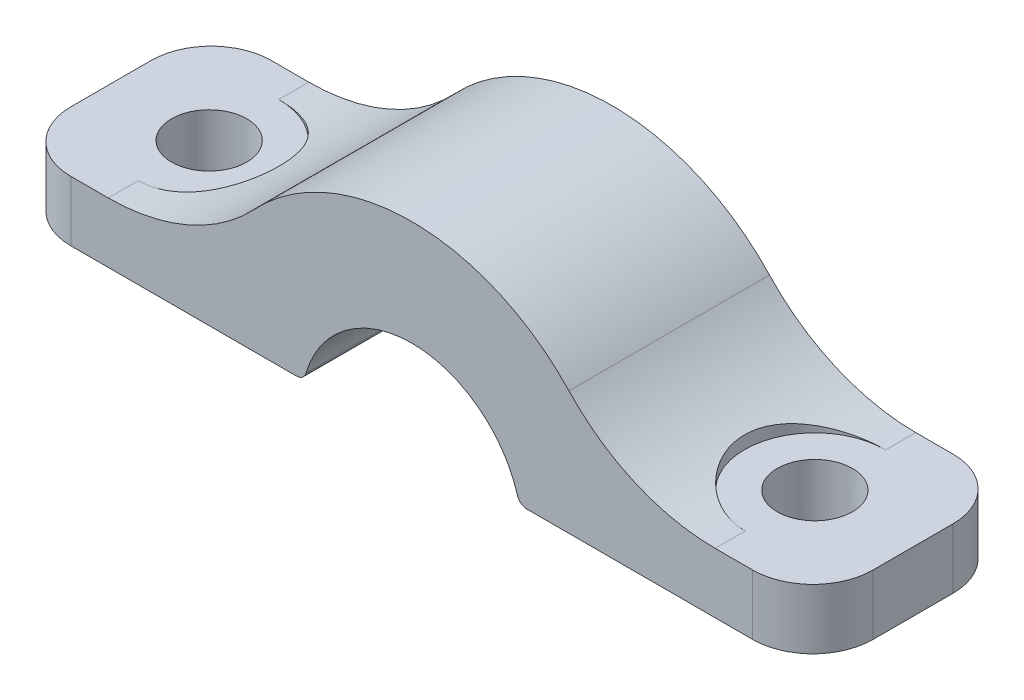
ISO-10303-21;
HEADER;
FILE_DESCRIPTION(('STEP AP214'),'2;1');
FILE_NAME('part.step','',(''),(''),'','','');
FILE_SCHEMA(('AUTOMOTIVE_DESIGN { 1 0 10303 214 1 1 1 1 }'));
ENDSEC;
DATA;
#1=APPLICATION_CONTEXT('core data for automotive mechanical design processes');
#2=APPLICATION_PROTOCOL_DEFINITION('international standard','automotive_design',2000,#1);
#3=PRODUCT_CONTEXT('',#1,'mechanical');
#4=PRODUCT('Part','Part','',(#3));
#5=PRODUCT_RELATED_PRODUCT_CATEGORY('part','',(#4));
#6=PRODUCT_DEFINITION_FORMATION('','',#4);
#7=PRODUCT_DEFINITION_CONTEXT('part definition',#1,'design');
#8=PRODUCT_DEFINITION('design','',#6,#7);
#9=PRODUCT_DEFINITION_SHAPE('','',#8);
#10=(LENGTH_UNIT() NAMED_UNIT(*) SI_UNIT(.MILLI.,.METRE.));
#11=(NAMED_UNIT(*) PLANE_ANGLE_UNIT() SI_UNIT($,.RADIAN.));
#12=(NAMED_UNIT(*) SI_UNIT($,.STERADIAN.) SOLID_ANGLE_UNIT());
#13=UNCERTAINTY_MEASURE_WITH_UNIT(LENGTH_MEASURE(1.E-05),#10,'distance_accuracy_value','');
#14=(GEOMETRIC_REPRESENTATION_CONTEXT(3) GLOBAL_UNCERTAINTY_ASSIGNED_CONTEXT((#13)) GLOBAL_UNIT_ASSIGNED_CONTEXT((#10,
#11,#12)) REPRESENTATION_CONTEXT('',''));
#15=CARTESIAN_POINT('',(0.,0.,0.));
#16=DIRECTION('',(0.,0.,1.));
#17=DIRECTION('',(1.,0.,0.));
#18=AXIS2_PLACEMENT_3D('',#15,#16,#17);
#19=CARTESIAN_POINT('',(15.1301850616574,17.,-5.));
#20=DIRECTION('',(0.,0.,1.));
#21=DIRECTION('',(1.,0.,0.));
#22=AXIS2_PLACEMENT_3D('',#19,#20,#21);
#23=CYLINDRICAL_SURFACE('',#22,10.);
#24=CARTESIAN_POINT('',(15.1301850616574,7.,-3.49986983501569));
#25=CARTESIAN_POINT('',(15.0348696329907,6.99998725890674,-3.50070439081716));
#26=CARTESIAN_POINT('',(14.9395281696116,7.00136244874504,-3.49762040862543));
#27=CARTESIAN_POINT('',(14.7495117129596,7.0067996720335,-3.48370609640878));
#28=CARTESIAN_POINT('',(14.6548365637417,7.01086105413496,-3.47287764421349));
#29=CARTESIAN_POINT('',(14.4670962984712,7.021566219,-3.44360782954279));
#30=CARTESIAN_POINT('',(14.3740273175886,7.02820249840069,-3.42518857738632));
#31=CARTESIAN_POINT('',(14.1899009938911,7.0438752521454,-3.38093142087537));
#32=CARTESIAN_POINT('',(14.0988437083568,7.05291179473893,-3.35509330556991));
#33=CARTESIAN_POINT('',(13.8297123648015,7.08328601278911,-3.26679129576509));
#34=CARTESIAN_POINT('',(13.6554232684673,7.1079037637054,-3.1934993760292));
#35=CARTESIAN_POINT('',(13.3216838443193,7.16343221324355,-3.0204334792506));
#36=CARTESIAN_POINT('',(13.1622417797051,7.1943463860301,-2.92064487291019));
#37=CARTESIAN_POINT('',(12.8566663401159,7.26057682971744,-2.69348988681878));
#38=CARTESIAN_POINT('',(12.711164571322,7.29600653740614,-2.56530570998191));
#39=CARTESIAN_POINT('',(12.4432188078221,7.36675220589586,-2.28667872214386));
#40=CARTESIAN_POINT('',(12.3207817073794,7.40206812959499,-2.13622927974848));
#41=CARTESIAN_POINT('',(12.0983841869598,7.46993276060704,-1.81117467909471));
#42=CARTESIAN_POINT('',(11.9993169679978,7.50234865970444,-1.63592785091686));
#43=CARTESIAN_POINT('',(11.8323363356384,7.55902414413907,-1.26995590106795));
#44=CARTESIAN_POINT('',(11.7644112623607,7.58328678121579,-1.07923660394833));
#45=CARTESIAN_POINT('',(11.6641433439372,7.61973743997865,-0.694905598410027));
#46=CARTESIAN_POINT('',(11.6306098500974,7.63232793600543,-0.501643954956914));
#47=CARTESIAN_POINT('',(11.5963262216062,7.64520413314645,-0.111853781625235));
#48=CARTESIAN_POINT('',(11.5955647033408,7.64549410694725,0.0846735901455507));
#49=CARTESIAN_POINT('',(11.6259908541086,7.6340599894839,0.46434110227836));
#50=CARTESIAN_POINT('',(11.6554900906093,7.62297080059553,0.647639358049137));
#51=CARTESIAN_POINT('',(11.7427538845311,7.59109763556561,1.00648124824026));
#52=CARTESIAN_POINT('',(11.800521545951,7.57031259478808,1.18202402876651));
#53=CARTESIAN_POINT('',(11.9435008725372,7.52103296048786,1.52359272322675));
#54=CARTESIAN_POINT('',(12.0291228868274,7.49242418040947,1.68942962421104));
#55=CARTESIAN_POINT('',(12.2251100149727,7.43072294324442,2.00487052914516));
#56=CARTESIAN_POINT('',(12.3354830266893,7.39762905632962,2.15446932897374));
#57=CARTESIAN_POINT('',(12.5854781988014,7.32827520332393,2.44247212910893));
#58=CARTESIAN_POINT('',(12.726442053358,7.29194364762675,2.57969452212338));
#59=CARTESIAN_POINT('',(13.0298673021754,7.22181924591325,2.82896644234392));
#60=CARTESIAN_POINT('',(13.1923341324289,7.18802704524858,2.9410095848001));
#61=CARTESIAN_POINT('',(13.4502196866979,7.14172623237282,3.08840970952813));
#62=CARTESIAN_POINT('',(13.5393176008019,7.12692353445877,3.13438150090923));
#63=CARTESIAN_POINT('',(13.7213725308676,7.09930798393055,3.21860657641995));
#64=CARTESIAN_POINT('',(13.8143279351849,7.08649431070862,3.25686304560363));
#65=CARTESIAN_POINT('',(14.0033605692721,7.06323348679693,3.32527885053502));
#66=CARTESIAN_POINT('',(14.0994349212996,7.05278422174209,3.35544542515392));
#67=CARTESIAN_POINT('',(14.2940257686933,7.03454018795168,3.40742495079426));
#68=CARTESIAN_POINT('',(14.3925412764296,7.0267443639212,3.42924122322918));
#69=CARTESIAN_POINT('',(14.5970987893935,7.01366457301147,3.46532637562945));
#70=CARTESIAN_POINT('',(14.7032436620794,7.0085544751322,3.47907834647272));
#71=CARTESIAN_POINT('',(14.9163335876992,7.00171355421096,3.49681653184522));
#72=CARTESIAN_POINT('',(15.0232776189401,6.99997897765508,3.50081359490048));
#73=CARTESIAN_POINT('',(15.1301850616574,7.,3.49986983501569));
#74=B_SPLINE_CURVE_WITH_KNOTS('',3,(#24,#25,#26,#27,#28,#29,#30,#31,#32,#33,#34,#35,#36,#37,#38,
#39,#40,#41,#42,#43,#44,#45,#46,#47,#48,#49,#50,#51,#52,#53,#54,#55,#56,#57,#58,#59,#60,#61,#62,
#63,#64,#65,#66,#67,#68,#69,#70,#71,#72,#73),.UNSPECIFIED.,.F.,.F.,(4,2,2,2,2,2,2,2,2,2,2,2,2,2,
2,2,2,2,2,2,2,2,2,2,4),(0.,0.285854114880405,0.571638941169156,0.856597157966133,
1.14156347818334,1.71072836286786,2.28020814951758,2.8689273554909,3.45782225734695,
4.06649938560818,4.67494843357368,5.26153852082778,5.84792484956934,6.40328303267487,
6.95870221026835,7.52270539683434,8.08688880941185,8.68436609721936,9.28199471794532,
9.58571174317528,9.88930312954732,10.1926219477456,10.4958199922607,10.8167769111839,
11.1373767278729),.UNSPECIFIED.);
#75=CARTESIAN_POINT('',(15.1301850616574,7.,-3.49986983501569));
#76=VERTEX_POINT('',#75);
#77=CARTESIAN_POINT('',(15.1301850616574,7.,3.49986983501569));
#78=VERTEX_POINT('',#77);
#79=EDGE_CURVE('E226',#76,#78,#74,.T.);
#80=ORIENTED_EDGE('',*,*,#79,.F.);
#81=DIRECTION('',(0.,0.,1.));
#82=VECTOR('',#81,1.);
#83=CARTESIAN_POINT('',(15.1301850616574,7.,0.));
#84=LINE('',#83,#82);
#85=CARTESIAN_POINT('',(15.1301850616574,7.,-5.));
#86=VERTEX_POINT('',#85);
#87=EDGE_CURVE('E203',#86,#76,#84,.T.);
#88=ORIENTED_EDGE('',*,*,#87,.F.);
#89=CARTESIAN_POINT('',(15.1301850616574,17.,-5.));
#90=DIRECTION('',(0.,0.,-1.));
#91=DIRECTION('',(-1.,0.,0.));
#92=AXIS2_PLACEMENT_3D('',#89,#90,#91);
#93=CIRCLE('',#92,10.);
#94=CARTESIAN_POINT('',(7.83852961025623,10.1566265060241,-5.));
#95=VERTEX_POINT('',#94);
#96=EDGE_CURVE('E210',#95,#86,#93,.F.);
#97=ORIENTED_EDGE('',*,*,#96,.F.);
#98=DIRECTION('',(0.,0.,1.));
#99=VECTOR('',#98,1.);
#100=CARTESIAN_POINT('',(7.83852961025623,10.1566265060241,-5.));
#101=LINE('',#100,#99);
#102=CARTESIAN_POINT('',(7.83852961025623,10.1566265060241,5.));
#103=VERTEX_POINT('',#102);
#104=EDGE_CURVE('E199',#103,#95,#101,.F.);
#105=ORIENTED_EDGE('',*,*,#104,.F.);
#106=CARTESIAN_POINT('',(15.1301850616574,17.,5.));
#107=DIRECTION('',(0.,0.,-1.));
#108=DIRECTION('',(-1.,0.,0.));
#109=AXIS2_PLACEMENT_3D('',#106,#107,#108);
#110=CIRCLE('',#109,10.);
#111=CARTESIAN_POINT('',(15.1301850616574,7.,5.));
#112=VERTEX_POINT('',#111);
#113=EDGE_CURVE('E212',#112,#103,#110,.T.);
#114=ORIENTED_EDGE('',*,*,#113,.F.);
#115=EDGE_CURVE('E202',#78,#112,#84,.T.);
#116=ORIENTED_EDGE('',*,*,#115,.F.);
#117=EDGE_LOOP('',(#80,#88,#97,#105,#114,#116));
#118=FACE_BOUND('',#117,.T.);
#119=ADVANCED_FACE('F35',(#118),#23,.F.);
#120=CARTESIAN_POINT('',(-15.1301850616574,17.,-5.));
#121=DIRECTION('',(0.,0.,1.));
#122=DIRECTION('',(1.,0.,0.));
#123=AXIS2_PLACEMENT_3D('',#120,#121,#122);
#124=CYLINDRICAL_SURFACE('',#123,10.);
#125=CARTESIAN_POINT('',(-15.1301850616574,7.,3.49986983501569));
#126=CARTESIAN_POINT('',(-15.0348696329907,6.99998725890674,3.50070439081716));
#127=CARTESIAN_POINT('',(-14.9395281696116,7.00136244874504,3.49762040862543));
#128=CARTESIAN_POINT('',(-14.7495117129596,7.0067996720335,3.48370609640878));
#129=CARTESIAN_POINT('',(-14.6548365637417,7.01086105413496,3.47287764421349));
#130=CARTESIAN_POINT('',(-14.4670962984712,7.021566219,3.44360782954279));
#131=CARTESIAN_POINT('',(-14.3740273175887,7.02820249840069,3.42518857738632));
#132=CARTESIAN_POINT('',(-14.1899009938911,7.0438752521454,3.38093142087537));
#133=CARTESIAN_POINT('',(-14.0988437083568,7.05291179473893,3.35509330556992));
#134=CARTESIAN_POINT('',(-13.8297123648015,7.08328601278911,3.26679129576509));
#135=CARTESIAN_POINT('',(-13.6554232684673,7.1079037637054,3.1934993760292));
#136=CARTESIAN_POINT('',(-13.3216838443193,7.16343221324355,3.0204334792506));
#137=CARTESIAN_POINT('',(-13.1622417797051,7.1943463860301,2.9206448729102));
#138=CARTESIAN_POINT('',(-12.8566663401159,7.26057682971744,2.69348988681879));
#139=CARTESIAN_POINT('',(-12.711164571322,7.29600653740614,2.56530570998191));
#140=CARTESIAN_POINT('',(-12.4432188078221,7.36675220589586,2.28667872214387));
#141=CARTESIAN_POINT('',(-12.3207817073794,7.40206812959499,2.13622927974849));
#142=CARTESIAN_POINT('',(-12.0983841869598,7.46993276060704,1.81117467909471));
#143=CARTESIAN_POINT('',(-11.9993169679978,7.50234865970444,1.63592785091686));
#144=CARTESIAN_POINT('',(-11.8323363356384,7.55902414413907,1.26995590106796));
#145=CARTESIAN_POINT('',(-11.7644112623607,7.58328678121578,1.07923660394833));
#146=CARTESIAN_POINT('',(-11.6641433439372,7.61973743997865,0.694905598410034));
#147=CARTESIAN_POINT('',(-11.6306098500974,7.63232793600543,0.501643954956922));
#148=CARTESIAN_POINT('',(-11.5963262216062,7.64520413314645,0.111853781625242));
#149=CARTESIAN_POINT('',(-11.5955647033408,7.64549410694725,-0.084673590145544));
#150=CARTESIAN_POINT('',(-11.6259908541086,7.6340599894839,-0.464341102278354));
#151=CARTESIAN_POINT('',(-11.6554900906093,7.62297080059553,-0.647639358049131));
#152=CARTESIAN_POINT('',(-11.7427538845311,7.59109763556561,-1.00648124824025));
#153=CARTESIAN_POINT('',(-11.800521545951,7.57031259478808,-1.18202402876651));
#154=CARTESIAN_POINT('',(-11.9435008725372,7.52103296048787,-1.52359272322675));
#155=CARTESIAN_POINT('',(-12.0291228868274,7.49242418040947,-1.68942962421104));
#156=CARTESIAN_POINT('',(-12.2251100149727,7.43072294324442,-2.00487052914516));
#157=CARTESIAN_POINT('',(-12.3354830266893,7.39762905632963,-2.15446932897373));
#158=CARTESIAN_POINT('',(-12.5854781988014,7.32827520332394,-2.44247212910893));
#159=CARTESIAN_POINT('',(-12.726442053358,7.29194364762676,-2.57969452212337));
#160=CARTESIAN_POINT('',(-13.0298673021754,7.22181924591325,-2.82896644234391));
#161=CARTESIAN_POINT('',(-13.1923341324289,7.18802704524858,-2.94100958480009));
#162=CARTESIAN_POINT('',(-13.4502196866979,7.14172623237282,-3.08840970952813));
#163=CARTESIAN_POINT('',(-13.5393176008019,7.12692353445877,-3.13438150090922));
#164=CARTESIAN_POINT('',(-13.7213725308676,7.09930798393055,-3.21860657641995));
#165=CARTESIAN_POINT('',(-13.8143279351849,7.08649431070862,-3.25686304560362));
#166=CARTESIAN_POINT('',(-14.0033605692721,7.06323348679693,-3.32527885053502));
#167=CARTESIAN_POINT('',(-14.0994349212996,7.0527842217421,-3.35544542515392));
#168=CARTESIAN_POINT('',(-14.2940257686933,7.03454018795168,-3.40742495079426));
#169=CARTESIAN_POINT('',(-14.3925412764295,7.0267443639212,-3.42924122322918));
#170=CARTESIAN_POINT('',(-14.5970987893935,7.01366457301147,-3.46532637562945));
#171=CARTESIAN_POINT('',(-14.7032436620794,7.0085544751322,-3.47907834647272));
#172=CARTESIAN_POINT('',(-14.9163335876992,7.00171355421096,-3.49681653184522));
#173=CARTESIAN_POINT('',(-15.0232776189401,6.99997897765508,-3.50081359490048));
#174=CARTESIAN_POINT('',(-15.1301850616574,7.,-3.49986983501569));
#175=B_SPLINE_CURVE_WITH_KNOTS('',3,(#125,#126,#127,#128,#129,#130,#131,#132,#133,#134,#135,
#136,#137,#138,#139,#140,#141,#142,#143,#144,#145,#146,#147,#148,#149,#150,#151,#152,#153,#154,
#155,#156,#157,#158,#159,#160,#161,#162,#163,#164,#165,#166,#167,#168,#169,#170,#171,#172,#173,
#174),.UNSPECIFIED.,.F.,.F.,(4,2,2,2,2,2,2,2,2,2,2,2,2,2,2,2,2,2,2,2,2,2,2,2,4),(0.,
0.285854114880405,0.571638941169158,0.856597157966135,1.14156347818334,1.71072836286786,
2.28020814951758,2.86892735549089,3.45782225734695,4.06649938560817,4.67494843357367,
5.26153852082777,5.84792484956934,6.40328303267487,6.95870221026835,7.52270539683434,
8.08688880941185,8.68436609721936,9.28199471794532,9.58571174317527,9.88930312954732,
10.1926219477456,10.4958199922607,10.8167769111839,11.1373767278729),.UNSPECIFIED.);
#176=CARTESIAN_POINT('',(-15.1301850616574,7.,3.49986983501569));
#177=VERTEX_POINT('',#176);
#178=CARTESIAN_POINT('',(-15.1301850616574,7.,-3.49986983501569));
#179=VERTEX_POINT('',#178);
#180=EDGE_CURVE('E218',#177,#179,#175,.T.);
#181=ORIENTED_EDGE('',*,*,#180,.F.);
#182=DIRECTION('',(0.,0.,-1.));
#183=VECTOR('',#182,1.);
#184=CARTESIAN_POINT('',(-15.1301850616574,7.,-5.));
#185=LINE('',#184,#183);
#186=CARTESIAN_POINT('',(-15.1301850616574,7.,5.));
#187=VERTEX_POINT('',#186);
#188=EDGE_CURVE('E207',#187,#177,#185,.T.);
#189=ORIENTED_EDGE('',*,*,#188,.F.);
#190=CARTESIAN_POINT('',(-15.1301850616574,17.,5.));
#191=DIRECTION('',(0.,0.,-1.));
#192=DIRECTION('',(-1.,0.,0.));
#193=AXIS2_PLACEMENT_3D('',#190,#191,#192);
#194=CIRCLE('',#193,10.);
#195=CARTESIAN_POINT('',(-7.83852961025623,10.1566265060241,5.));
#196=VERTEX_POINT('',#195);
#197=EDGE_CURVE('E216',#196,#187,#194,.T.);
#198=ORIENTED_EDGE('',*,*,#197,.F.);
#199=DIRECTION('',(0.,0.,1.));
#200=VECTOR('',#199,1.);
#201=CARTESIAN_POINT('',(-7.83852961025623,10.1566265060241,-5.));
#202=LINE('',#201,#200);
#203=CARTESIAN_POINT('',(-7.83852961025623,10.1566265060241,-5.));
#204=VERTEX_POINT('',#203);
#205=EDGE_CURVE('E197',#204,#196,#202,.T.);
#206=ORIENTED_EDGE('',*,*,#205,.F.);
#207=CARTESIAN_POINT('',(-15.1301850616574,17.,-5.));
#208=DIRECTION('',(0.,0.,-1.));
#209=DIRECTION('',(-1.,0.,0.));
#210=AXIS2_PLACEMENT_3D('',#207,#208,#209);
#211=CIRCLE('',#210,10.);
#212=CARTESIAN_POINT('',(-15.1301850616574,7.,-5.));
#213=VERTEX_POINT('',#212);
#214=EDGE_CURVE('E214',#213,#204,#211,.F.);
#215=ORIENTED_EDGE('',*,*,#214,.F.);
#216=EDGE_CURVE('E206',#179,#213,#185,.T.);
#217=ORIENTED_EDGE('',*,*,#216,.F.);
#218=EDGE_LOOP('',(#181,#189,#198,#206,#215,#217));
#219=FACE_BOUND('',#218,.T.);
#220=ADVANCED_FACE('F234',(#219),#124,.F.);
#221=CARTESIAN_POINT('',(-15.1,-6.,0.));
#222=DIRECTION('',(0.,1.,0.));
#223=DIRECTION('',(0.,0.,1.));
#224=AXIS2_PLACEMENT_3D('',#221,#222,#223);
#225=CYLINDRICAL_SURFACE('',#224,1.875);
#226=CARTESIAN_POINT('',(-15.1,4.,0.));
#227=DIRECTION('',(0.,1.,0.));
#228=DIRECTION('',(0.,0.,1.));
#229=AXIS2_PLACEMENT_3D('',#226,#227,#228);
#230=CIRCLE('',#229,1.875);
#231=CARTESIAN_POINT('',(-15.1,4.,1.875));
#232=VERTEX_POINT('',#231);
#233=EDGE_CURVE('E373',#232,#232,#230,.F.);
#234=ORIENTED_EDGE('',*,*,#233,.T.);
#235=EDGE_LOOP('',(#234));
#236=FACE_BOUND('',#235,.T.);
#237=CARTESIAN_POINT('',(-15.1,7.,0.));
#238=DIRECTION('',(0.,1.,0.));
#239=DIRECTION('',(0.,0.,1.));
#240=AXIS2_PLACEMENT_3D('',#237,#238,#239);
#241=CIRCLE('',#240,1.875);
#242=CARTESIAN_POINT('',(-15.1,7.,1.875));
#243=VERTEX_POINT('',#242);
#244=EDGE_CURVE('E369',#243,#243,#241,.T.);
#245=ORIENTED_EDGE('',*,*,#244,.T.);
#246=EDGE_LOOP('',(#245));
#247=FACE_BOUND('',#246,.T.);
#248=ADVANCED_FACE('F248',(#236,#247),#225,.F.);
#249=CARTESIAN_POINT('',(0.,2.8,-5.));
#250=DIRECTION('',(0.,0.,1.));
#251=DIRECTION('',(1.,0.,0.));
#252=AXIS2_PLACEMENT_3D('',#249,#250,#251);
#253=CYLINDRICAL_SURFACE('',#252,10.75);
#254=CARTESIAN_POINT('',(0.,2.8,5.));
#255=DIRECTION('',(0.,0.,1.));
#256=DIRECTION('',(-1.,0.,0.));
#257=AXIS2_PLACEMENT_3D('',#254,#255,#256);
#258=CIRCLE('',#257,10.75);
#259=EDGE_CURVE('E340',#103,#196,#258,.T.);
#260=ORIENTED_EDGE('',*,*,#259,.F.);
#261=ORIENTED_EDGE('',*,*,#104,.T.);
#262=CARTESIAN_POINT('',(0.,2.8,-5.));
#263=DIRECTION('',(0.,0.,1.));
#264=DIRECTION('',(-1.,0.,0.));
#265=AXIS2_PLACEMENT_3D('',#262,#263,#264);
#266=CIRCLE('',#265,10.75);
#267=EDGE_CURVE('E345',#95,#204,#266,.T.);
#268=ORIENTED_EDGE('',*,*,#267,.T.);
#269=ORIENTED_EDGE('',*,*,#205,.T.);
#270=EDGE_LOOP('',(#260,#261,#268,#269));
#271=FACE_BOUND('',#270,.T.);
#272=ADVANCED_FACE('F251',(#271),#253,.T.);
#273=CARTESIAN_POINT('',(0.,2.8,-5.));
#274=DIRECTION('',(0.,0.,1.));
#275=DIRECTION('',(1.,0.,0.));
#276=AXIS2_PLACEMENT_3D('',#273,#274,#275);
#277=CYLINDRICAL_SURFACE('',#276,5.5);
#278=CARTESIAN_POINT('',(0.,2.8,5.));
#279=DIRECTION('',(0.,0.,-1.));
#280=DIRECTION('',(-1.,0.,0.));
#281=AXIS2_PLACEMENT_3D('',#278,#279,#280);
#282=CIRCLE('',#281,5.5);
#283=CARTESIAN_POINT('',(-5.27461820629913,4.35833333333333,5.));
#284=VERTEX_POINT('',#283);
#285=CARTESIAN_POINT('',(5.27461820629913,4.35833333333333,5.));
#286=VERTEX_POINT('',#285);
#287=EDGE_CURVE('E337',#284,#286,#282,.T.);
#288=ORIENTED_EDGE('',*,*,#287,.F.);
#289=DIRECTION('',(0.,0.,1.));
#290=VECTOR('',#289,1.);
#291=CARTESIAN_POINT('',(-5.27461820629913,4.35833333333333,-5.));
#292=LINE('',#291,#290);
#293=CARTESIAN_POINT('',(-5.27461820629913,4.35833333333333,-5.));
#294=VERTEX_POINT('',#293);
#295=EDGE_CURVE('E415',#284,#294,#292,.F.);
#296=ORIENTED_EDGE('',*,*,#295,.T.);
#297=CARTESIAN_POINT('',(0.,2.8,-5.));
#298=DIRECTION('',(0.,0.,-1.));
#299=DIRECTION('',(-1.,0.,0.));
#300=AXIS2_PLACEMENT_3D('',#297,#298,#299);
#301=CIRCLE('',#300,5.5);
#302=CARTESIAN_POINT('',(5.27461820629913,4.35833333333333,-5.));
#303=VERTEX_POINT('',#302);
#304=EDGE_CURVE('E343',#294,#303,#301,.T.);
#305=ORIENTED_EDGE('',*,*,#304,.T.);
#306=DIRECTION('',(0.,0.,1.));
#307=VECTOR('',#306,1.);
#308=CARTESIAN_POINT('',(5.27461820629913,4.35833333333333,-5.));
#309=LINE('',#308,#307);
#310=EDGE_CURVE('E408',#303,#286,#309,.T.);
#311=ORIENTED_EDGE('',*,*,#310,.T.);
#312=EDGE_LOOP('',(#288,#296,#305,#311));
#313=FACE_BOUND('',#312,.T.);
#314=ADVANCED_FACE('F278',(#313),#277,.F.);
#315=CARTESIAN_POINT('',(0.,2.8,-5.));
#316=DIRECTION('',(0.,0.,-1.));
#317=DIRECTION('',(-1.,0.,0.));
#318=AXIS2_PLACEMENT_3D('',#315,#316,#317);
#319=PLANE('',#318);
#320=ORIENTED_EDGE('',*,*,#304,.F.);
#321=CARTESIAN_POINT('',(-5.75412895232632,4.5,-5.));
#322=DIRECTION('',(0.,0.,-1.));
#323=DIRECTION('',(-1.,0.,0.));
#324=AXIS2_PLACEMENT_3D('',#321,#322,#323);
#325=CIRCLE('',#324,0.5);
#326=CARTESIAN_POINT('',(-5.75412895232632,4.,-5.));
#327=VERTEX_POINT('',#326);
#328=EDGE_CURVE('E43',#294,#327,#325,.T.);
#329=ORIENTED_EDGE('',*,*,#328,.T.);
#330=DIRECTION('',(1.,0.,0.));
#331=VECTOR('',#330,1.);
#332=CARTESIAN_POINT('',(0.,4.,-5.));
#333=LINE('',#332,#331);
#334=CARTESIAN_POINT('',(-17.,4.,-5.));
#335=VERTEX_POINT('',#334);
#336=EDGE_CURVE('E391',#335,#327,#333,.T.);
#337=ORIENTED_EDGE('',*,*,#336,.F.);
#338=DIRECTION('',(0.,-1.,0.));
#339=VECTOR('',#338,1.);
#340=CARTESIAN_POINT('',(-17.,7.,-5.));
#341=LINE('',#340,#339);
#342=CARTESIAN_POINT('',(-17.,7.,-5.));
#343=VERTEX_POINT('',#342);
#344=EDGE_CURVE('E348',#335,#343,#341,.F.);
#345=ORIENTED_EDGE('',*,*,#344,.T.);
#346=DIRECTION('',(-1.,0.,0.));
#347=VECTOR('',#346,1.);
#348=CARTESIAN_POINT('',(-20.,7.,-5.));
#349=LINE('',#348,#347);
#350=EDGE_CURVE('E334',#213,#343,#349,.T.);
#351=ORIENTED_EDGE('',*,*,#350,.F.);
#352=ORIENTED_EDGE('',*,*,#214,.T.);
#353=ORIENTED_EDGE('',*,*,#267,.F.);
#354=ORIENTED_EDGE('',*,*,#96,.T.);
#355=DIRECTION('',(-1.,0.,0.));
#356=VECTOR('',#355,1.);
#357=CARTESIAN_POINT('',(20.,7.,-5.));
#358=LINE('',#357,#356);
#359=CARTESIAN_POINT('',(17.,7.,-5.));
#360=VERTEX_POINT('',#359);
#361=EDGE_CURVE('E314',#360,#86,#358,.T.);
#362=ORIENTED_EDGE('',*,*,#361,.F.);
#363=DIRECTION('',(0.,-1.,0.));
#364=VECTOR('',#363,1.);
#365=CARTESIAN_POINT('',(17.,0.,-5.));
#366=LINE('',#365,#364);
#367=CARTESIAN_POINT('',(17.,4.,-5.));
#368=VERTEX_POINT('',#367);
#369=EDGE_CURVE('E350',#360,#368,#366,.T.);
#370=ORIENTED_EDGE('',*,*,#369,.T.);
#371=CARTESIAN_POINT('',(5.75412895232632,4.,-5.));
#372=VERTEX_POINT('',#371);
#373=EDGE_CURVE('E381',#372,#368,#333,.T.);
#374=ORIENTED_EDGE('',*,*,#373,.F.);
#375=CARTESIAN_POINT('',(5.75412895232632,4.5,-5.));
#376=DIRECTION('',(0.,0.,-1.));
#377=DIRECTION('',(-1.,0.,0.));
#378=AXIS2_PLACEMENT_3D('',#375,#376,#377);
#379=CIRCLE('',#378,0.5);
#380=EDGE_CURVE('E50',#372,#303,#379,.T.);
#381=ORIENTED_EDGE('',*,*,#380,.T.);
#382=EDGE_LOOP('',(#320,#329,#337,#345,#351,#352,#353,#354,#362,#370,#374,#381));
#383=FACE_BOUND('',#382,.T.);
#384=ADVANCED_FACE('F274',(#383),#319,.T.);
#385=CARTESIAN_POINT('',(0.,2.8,5.));
#386=DIRECTION('',(0.,0.,-1.));
#387=DIRECTION('',(-1.,0.,0.));
#388=AXIS2_PLACEMENT_3D('',#385,#386,#387);
#389=PLANE('',#388);
#390=DIRECTION('',(1.,0.,0.));
#391=VECTOR('',#390,1.);
#392=CARTESIAN_POINT('',(0.,4.,5.));
#393=LINE('',#392,#391);
#394=CARTESIAN_POINT('',(-17.,4.,5.));
#395=VERTEX_POINT('',#394);
#396=CARTESIAN_POINT('',(-5.75412895232632,4.,5.));
#397=VERTEX_POINT('',#396);
#398=EDGE_CURVE('E168',#395,#397,#393,.T.);
#399=ORIENTED_EDGE('',*,*,#398,.T.);
#400=CARTESIAN_POINT('',(-5.75412895232632,4.5,5.));
#401=DIRECTION('',(0.,0.,-1.));
#402=DIRECTION('',(-1.,0.,0.));
#403=AXIS2_PLACEMENT_3D('',#400,#401,#402);
#404=CIRCLE('',#403,0.5);
#405=EDGE_CURVE('E409',#397,#284,#404,.F.);
#406=ORIENTED_EDGE('',*,*,#405,.T.);
#407=ORIENTED_EDGE('',*,*,#287,.T.);
#408=CARTESIAN_POINT('',(5.75412895232632,4.5,5.));
#409=DIRECTION('',(0.,0.,-1.));
#410=DIRECTION('',(-1.,0.,0.));
#411=AXIS2_PLACEMENT_3D('',#408,#409,#410);
#412=CIRCLE('',#411,0.5);
#413=CARTESIAN_POINT('',(5.75412895232632,4.,5.));
#414=VERTEX_POINT('',#413);
#415=EDGE_CURVE('E399',#286,#414,#412,.F.);
#416=ORIENTED_EDGE('',*,*,#415,.T.);
#417=CARTESIAN_POINT('',(17.,4.,5.));
#418=VERTEX_POINT('',#417);
#419=EDGE_CURVE('E384',#414,#418,#393,.T.);
#420=ORIENTED_EDGE('',*,*,#419,.T.);
#421=DIRECTION('',(0.,-1.,0.));
#422=VECTOR('',#421,1.);
#423=CARTESIAN_POINT('',(17.,2.8,5.));
#424=LINE('',#423,#422);
#425=CARTESIAN_POINT('',(17.,7.,5.));
#426=VERTEX_POINT('',#425);
#427=EDGE_CURVE('E187',#418,#426,#424,.F.);
#428=ORIENTED_EDGE('',*,*,#427,.T.);
#429=DIRECTION('',(1.,0.,0.));
#430=VECTOR('',#429,1.);
#431=CARTESIAN_POINT('',(20.,7.,5.));
#432=LINE('',#431,#430);
#433=EDGE_CURVE('E320',#112,#426,#432,.T.);
#434=ORIENTED_EDGE('',*,*,#433,.F.);
#435=ORIENTED_EDGE('',*,*,#113,.T.);
#436=ORIENTED_EDGE('',*,*,#259,.T.);
#437=ORIENTED_EDGE('',*,*,#197,.T.);
#438=DIRECTION('',(1.,0.,0.));
#439=VECTOR('',#438,1.);
#440=CARTESIAN_POINT('',(-20.,7.,5.));
#441=LINE('',#440,#439);
#442=CARTESIAN_POINT('',(-17.,7.,5.));
#443=VERTEX_POINT('',#442);
#444=EDGE_CURVE('E331',#443,#187,#441,.T.);
#445=ORIENTED_EDGE('',*,*,#444,.F.);
#446=DIRECTION('',(0.,-1.,0.));
#447=VECTOR('',#446,1.);
#448=CARTESIAN_POINT('',(-17.,2.8,5.));
#449=LINE('',#448,#447);
#450=EDGE_CURVE('E190',#443,#395,#449,.T.);
#451=ORIENTED_EDGE('',*,*,#450,.T.);
#452=EDGE_LOOP('',(#399,#406,#407,#416,#420,#428,#434,#435,#436,#437,#445,#451));
#453=FACE_BOUND('',#452,.T.);
#454=ADVANCED_FACE('F271',(#453),#389,.F.);
#455=CARTESIAN_POINT('',(-20.,7.,-5.));
#456=DIRECTION('',(1.,0.,0.));
#457=DIRECTION('',(0.,0.,-1.));
#458=AXIS2_PLACEMENT_3D('',#455,#456,#457);
#459=PLANE('',#458);
#460=DIRECTION('',(0.,-1.,0.));
#461=VECTOR('',#460,1.);
#462=CARTESIAN_POINT('',(-20.,0.,-2.));
#463=LINE('',#462,#461);
#464=CARTESIAN_POINT('',(-20.,7.,-2.));
#465=VERTEX_POINT('',#464);
#466=CARTESIAN_POINT('',(-20.,4.,-2.));
#467=VERTEX_POINT('',#466);
#468=EDGE_CURVE('E182',#465,#467,#463,.T.);
#469=ORIENTED_EDGE('',*,*,#468,.T.);
#470=DIRECTION('',(0.,0.,1.));
#471=VECTOR('',#470,1.);
#472=CARTESIAN_POINT('',(-20.,4.,-5.));
#473=LINE('',#472,#471);
#474=CARTESIAN_POINT('',(-20.,4.,2.));
#475=VERTEX_POINT('',#474);
#476=EDGE_CURVE('E164',#467,#475,#473,.T.);
#477=ORIENTED_EDGE('',*,*,#476,.T.);
#478=DIRECTION('',(0.,-1.,0.));
#479=VECTOR('',#478,1.);
#480=CARTESIAN_POINT('',(-20.,7.,2.));
#481=LINE('',#480,#479);
#482=CARTESIAN_POINT('',(-20.,7.,2.));
#483=VERTEX_POINT('',#482);
#484=EDGE_CURVE('E179',#475,#483,#481,.F.);
#485=ORIENTED_EDGE('',*,*,#484,.T.);
#486=DIRECTION('',(0.,0.,1.));
#487=VECTOR('',#486,1.);
#488=CARTESIAN_POINT('',(-20.,7.,-5.));
#489=LINE('',#488,#487);
#490=EDGE_CURVE('E324',#465,#483,#489,.T.);
#491=ORIENTED_EDGE('',*,*,#490,.F.);
#492=EDGE_LOOP('',(#469,#477,#485,#491));
#493=FACE_BOUND('',#492,.T.);
#494=ADVANCED_FACE('F177',(#493),#459,.F.);
#495=CARTESIAN_POINT('',(0.,7.,0.));
#496=DIRECTION('',(0.,1.,0.));
#497=DIRECTION('',(0.,0.,1.));
#498=AXIS2_PLACEMENT_3D('',#495,#496,#497);
#499=PLANE('',#498);
#500=ORIENTED_EDGE('',*,*,#188,.T.);
#501=CARTESIAN_POINT('',(-15.1,7.,0.));
#502=DIRECTION('',(0.,1.,0.));
#503=DIRECTION('',(0.,0.,1.));
#504=AXIS2_PLACEMENT_3D('',#501,#502,#503);
#505=CIRCLE('',#504,3.5);
#506=EDGE_CURVE('E368',#177,#179,#505,.T.);
#507=ORIENTED_EDGE('',*,*,#506,.T.);
#508=ORIENTED_EDGE('',*,*,#216,.T.);
#509=ORIENTED_EDGE('',*,*,#350,.T.);
#510=CARTESIAN_POINT('',(-17.,7.,-2.));
#511=DIRECTION('',(0.,1.,0.));
#512=DIRECTION('',(0.,0.,1.));
#513=AXIS2_PLACEMENT_3D('',#510,#511,#512);
#514=CIRCLE('',#513,3.);
#515=EDGE_CURVE('E195',#343,#465,#514,.T.);
#516=ORIENTED_EDGE('',*,*,#515,.T.);
#517=ORIENTED_EDGE('',*,*,#490,.T.);
#518=CARTESIAN_POINT('',(-17.,7.,2.));
#519=DIRECTION('',(0.,1.,0.));
#520=DIRECTION('',(0.,0.,1.));
#521=AXIS2_PLACEMENT_3D('',#518,#519,#520);
#522=CIRCLE('',#521,3.);
#523=EDGE_CURVE('E186',#483,#443,#522,.T.);
#524=ORIENTED_EDGE('',*,*,#523,.T.);
#525=ORIENTED_EDGE('',*,*,#444,.T.);
#526=EDGE_LOOP('',(#500,#507,#508,#509,#516,#517,#524,#525));
#527=FACE_BOUND('',#526,.T.);
#528=ORIENTED_EDGE('',*,*,#244,.F.);
#529=EDGE_LOOP('',(#528));
#530=FACE_BOUND('',#529,.T.);
#531=ADVANCED_FACE('F264',(#527,#530),#499,.T.);
#532=CARTESIAN_POINT('',(20.,7.,-5.));
#533=DIRECTION('',(-1.,0.,0.));
#534=DIRECTION('',(0.,0.,1.));
#535=AXIS2_PLACEMENT_3D('',#532,#533,#534);
#536=PLANE('',#535);
#537=DIRECTION('',(0.,-1.,0.));
#538=VECTOR('',#537,1.);
#539=CARTESIAN_POINT('',(20.,7.,2.));
#540=LINE('',#539,#538);
#541=CARTESIAN_POINT('',(20.,7.,2.));
#542=VERTEX_POINT('',#541);
#543=CARTESIAN_POINT('',(20.,4.,2.));
#544=VERTEX_POINT('',#543);
#545=EDGE_CURVE('E352',#542,#544,#540,.T.);
#546=ORIENTED_EDGE('',*,*,#545,.T.);
#547=DIRECTION('',(0.,0.,-1.));
#548=VECTOR('',#547,1.);
#549=CARTESIAN_POINT('',(20.,4.,-5.));
#550=LINE('',#549,#548);
#551=CARTESIAN_POINT('',(20.,4.,-2.));
#552=VERTEX_POINT('',#551);
#553=EDGE_CURVE('E385',#544,#552,#550,.T.);
#554=ORIENTED_EDGE('',*,*,#553,.T.);
#555=DIRECTION('',(0.,-1.,0.));
#556=VECTOR('',#555,1.);
#557=CARTESIAN_POINT('',(20.,7.,-2.));
#558=LINE('',#557,#556);
#559=CARTESIAN_POINT('',(20.,7.,-2.));
#560=VERTEX_POINT('',#559);
#561=EDGE_CURVE('E355',#552,#560,#558,.F.);
#562=ORIENTED_EDGE('',*,*,#561,.T.);
#563=DIRECTION('',(0.,0.,-1.));
#564=VECTOR('',#563,1.);
#565=CARTESIAN_POINT('',(20.,7.,-5.));
#566=LINE('',#565,#564);
#567=EDGE_CURVE('E321',#542,#560,#566,.T.);
#568=ORIENTED_EDGE('',*,*,#567,.F.);
#569=EDGE_LOOP('',(#546,#554,#562,#568));
#570=FACE_BOUND('',#569,.T.);
#571=ADVANCED_FACE('F260',(#570),#536,.F.);
#572=CARTESIAN_POINT('',(0.,7.,0.));
#573=DIRECTION('',(0.,-1.,0.));
#574=DIRECTION('',(0.,0.,-1.));
#575=AXIS2_PLACEMENT_3D('',#572,#573,#574);
#576=PLANE('',#575);
#577=ORIENTED_EDGE('',*,*,#87,.T.);
#578=CARTESIAN_POINT('',(15.1,7.,0.));
#579=DIRECTION('',(0.,1.,0.));
#580=DIRECTION('',(0.,0.,-1.));
#581=AXIS2_PLACEMENT_3D('',#578,#579,#580);
#582=CIRCLE('',#581,3.5);
#583=EDGE_CURVE('E312',#76,#78,#582,.T.);
#584=ORIENTED_EDGE('',*,*,#583,.T.);
#585=ORIENTED_EDGE('',*,*,#115,.T.);
#586=ORIENTED_EDGE('',*,*,#433,.T.);
#587=CARTESIAN_POINT('',(17.,7.,2.));
#588=DIRECTION('',(0.,-1.,0.));
#589=DIRECTION('',(0.,0.,-1.));
#590=AXIS2_PLACEMENT_3D('',#587,#588,#589);
#591=CIRCLE('',#590,3.);
#592=EDGE_CURVE('E357',#426,#542,#591,.F.);
#593=ORIENTED_EDGE('',*,*,#592,.T.);
#594=ORIENTED_EDGE('',*,*,#567,.T.);
#595=CARTESIAN_POINT('',(17.,7.,-2.));
#596=DIRECTION('',(0.,-1.,0.));
#597=DIRECTION('',(0.,0.,-1.));
#598=AXIS2_PLACEMENT_3D('',#595,#596,#597);
#599=CIRCLE('',#598,3.);
#600=EDGE_CURVE('E317',#560,#360,#599,.F.);
#601=ORIENTED_EDGE('',*,*,#600,.T.);
#602=ORIENTED_EDGE('',*,*,#361,.T.);
#603=EDGE_LOOP('',(#577,#584,#585,#586,#593,#594,#601,#602));
#604=FACE_BOUND('',#603,.T.);
#605=CARTESIAN_POINT('',(15.1,7.,0.));
#606=DIRECTION('',(0.,-1.,0.));
#607=DIRECTION('',(0.,0.,-1.));
#608=AXIS2_PLACEMENT_3D('',#605,#606,#607);
#609=CIRCLE('',#608,1.875);
#610=CARTESIAN_POINT('',(15.1,7.,-1.875));
#611=VERTEX_POINT('',#610);
#612=EDGE_CURVE('E326',#611,#611,#609,.T.);
#613=ORIENTED_EDGE('',*,*,#612,.T.);
#614=EDGE_LOOP('',(#613));
#615=FACE_BOUND('',#614,.T.);
#616=ADVANCED_FACE('F256',(#604,#615),#576,.F.);
#617=CARTESIAN_POINT('',(17.,2.8,-2.));
#618=DIRECTION('',(0.,1.,0.));
#619=DIRECTION('',(0.,0.,1.));
#620=AXIS2_PLACEMENT_3D('',#617,#618,#619);
#621=CYLINDRICAL_SURFACE('',#620,3.);
#622=CARTESIAN_POINT('',(17.,4.,-2.));
#623=DIRECTION('',(0.,1.,0.));
#624=DIRECTION('',(0.,0.,1.));
#625=AXIS2_PLACEMENT_3D('',#622,#623,#624);
#626=CIRCLE('',#625,3.);
#627=EDGE_CURVE('E382',#368,#552,#626,.F.);
#628=ORIENTED_EDGE('',*,*,#627,.F.);
#629=ORIENTED_EDGE('',*,*,#369,.F.);
#630=ORIENTED_EDGE('',*,*,#600,.F.);
#631=ORIENTED_EDGE('',*,*,#561,.F.);
#632=EDGE_LOOP('',(#628,#629,#630,#631));
#633=FACE_BOUND('',#632,.T.);
#634=ADVANCED_FACE('F259',(#633),#621,.T.);
#635=CARTESIAN_POINT('',(17.,7.,2.));
#636=DIRECTION('',(0.,-1.,0.));
#637=DIRECTION('',(0.,0.,-1.));
#638=AXIS2_PLACEMENT_3D('',#635,#636,#637);
#639=CYLINDRICAL_SURFACE('',#638,3.);
#640=CARTESIAN_POINT('',(17.,4.,2.));
#641=DIRECTION('',(0.,1.,0.));
#642=DIRECTION('',(0.,0.,1.));
#643=AXIS2_PLACEMENT_3D('',#640,#641,#642);
#644=CIRCLE('',#643,3.);
#645=EDGE_CURVE('E388',#544,#418,#644,.F.);
#646=ORIENTED_EDGE('',*,*,#645,.F.);
#647=ORIENTED_EDGE('',*,*,#545,.F.);
#648=ORIENTED_EDGE('',*,*,#592,.F.);
#649=ORIENTED_EDGE('',*,*,#427,.F.);
#650=EDGE_LOOP('',(#646,#647,#648,#649));
#651=FACE_BOUND('',#650,.T.);
#652=ADVANCED_FACE('F287',(#651),#639,.T.);
#653=CARTESIAN_POINT('',(-17.,7.,-2.));
#654=DIRECTION('',(0.,1.,0.));
#655=DIRECTION('',(0.,0.,1.));
#656=AXIS2_PLACEMENT_3D('',#653,#654,#655);
#657=CYLINDRICAL_SURFACE('',#656,3.);
#658=CARTESIAN_POINT('',(-17.,4.,-2.));
#659=DIRECTION('',(0.,1.,0.));
#660=DIRECTION('',(0.,0.,1.));
#661=AXIS2_PLACEMENT_3D('',#658,#659,#660);
#662=CIRCLE('',#661,3.);
#663=EDGE_CURVE('E393',#467,#335,#662,.F.);
#664=ORIENTED_EDGE('',*,*,#663,.F.);
#665=ORIENTED_EDGE('',*,*,#468,.F.);
#666=ORIENTED_EDGE('',*,*,#515,.F.);
#667=ORIENTED_EDGE('',*,*,#344,.F.);
#668=EDGE_LOOP('',(#664,#665,#666,#667));
#669=FACE_BOUND('',#668,.T.);
#670=ADVANCED_FACE('F291',(#669),#657,.T.);
#671=CARTESIAN_POINT('',(-17.,2.8,2.));
#672=DIRECTION('',(0.,-1.,0.));
#673=DIRECTION('',(0.,0.,-1.));
#674=AXIS2_PLACEMENT_3D('',#671,#672,#673);
#675=CYLINDRICAL_SURFACE('',#674,3.);
#676=CARTESIAN_POINT('',(-17.,4.,2.));
#677=DIRECTION('',(0.,1.,0.));
#678=DIRECTION('',(0.,0.,1.));
#679=AXIS2_PLACEMENT_3D('',#676,#677,#678);
#680=CIRCLE('',#679,3.);
#681=EDGE_CURVE('E159',#395,#475,#680,.F.);
#682=ORIENTED_EDGE('',*,*,#681,.F.);
#683=ORIENTED_EDGE('',*,*,#450,.F.);
#684=ORIENTED_EDGE('',*,*,#523,.F.);
#685=ORIENTED_EDGE('',*,*,#484,.F.);
#686=EDGE_LOOP('',(#682,#683,#684,#685));
#687=FACE_BOUND('',#686,.T.);
#688=ADVANCED_FACE('F185',(#687),#675,.T.);
#689=CARTESIAN_POINT('',(15.1,-6.,0.));
#690=DIRECTION('',(0.,1.,0.));
#691=DIRECTION('',(0.,0.,1.));
#692=AXIS2_PLACEMENT_3D('',#689,#690,#691);
#693=CYLINDRICAL_SURFACE('',#692,1.875);
#694=CARTESIAN_POINT('',(15.1,4.,0.));
#695=DIRECTION('',(0.,1.,0.));
#696=DIRECTION('',(0.,0.,1.));
#697=AXIS2_PLACEMENT_3D('',#694,#695,#696);
#698=CIRCLE('',#697,1.875);
#699=CARTESIAN_POINT('',(15.1,4.,1.875));
#700=VERTEX_POINT('',#699);
#701=EDGE_CURVE('E173',#700,#700,#698,.F.);
#702=ORIENTED_EDGE('',*,*,#701,.T.);
#703=EDGE_LOOP('',(#702));
#704=FACE_BOUND('',#703,.T.);
#705=ORIENTED_EDGE('',*,*,#612,.F.);
#706=EDGE_LOOP('',(#705));
#707=FACE_BOUND('',#706,.T.);
#708=ADVANCED_FACE('F246',(#704,#707),#693,.F.);
#709=CARTESIAN_POINT('',(15.1,17.,0.));
#710=DIRECTION('',(0.,-1.,0.));
#711=DIRECTION('',(0.,0.,-1.));
#712=AXIS2_PLACEMENT_3D('',#709,#710,#711);
#713=CYLINDRICAL_SURFACE('',#712,3.5);
#714=ORIENTED_EDGE('',*,*,#79,.T.);
#715=ORIENTED_EDGE('',*,*,#583,.F.);
#716=EDGE_LOOP('',(#714,#715));
#717=FACE_BOUND('',#716,.T.);
#718=ADVANCED_FACE('F241',(#717),#713,.F.);
#719=CARTESIAN_POINT('',(-15.1,17.,0.));
#720=DIRECTION('',(0.,-1.,0.));
#721=DIRECTION('',(0.,0.,-1.));
#722=AXIS2_PLACEMENT_3D('',#719,#720,#721);
#723=CYLINDRICAL_SURFACE('',#722,3.5);
#724=ORIENTED_EDGE('',*,*,#180,.T.);
#725=ORIENTED_EDGE('',*,*,#506,.F.);
#726=EDGE_LOOP('',(#724,#725));
#727=FACE_BOUND('',#726,.T.);
#728=ADVANCED_FACE('F236',(#727),#723,.F.);
#729=CARTESIAN_POINT('',(0.,4.,0.));
#730=DIRECTION('',(0.,1.,0.));
#731=DIRECTION('',(0.,0.,1.));
#732=AXIS2_PLACEMENT_3D('',#729,#730,#731);
#733=PLANE('',#732);
#734=ORIENTED_EDGE('',*,*,#419,.F.);
#735=DIRECTION('',(0.,0.,-1.));
#736=VECTOR('',#735,1.);
#737=CARTESIAN_POINT('',(5.75412895232632,4.,-5.));
#738=LINE('',#737,#736);
#739=EDGE_CURVE('E11',#414,#372,#738,.T.);
#740=ORIENTED_EDGE('',*,*,#739,.T.);
#741=ORIENTED_EDGE('',*,*,#373,.T.);
#742=ORIENTED_EDGE('',*,*,#627,.T.);
#743=ORIENTED_EDGE('',*,*,#553,.F.);
#744=ORIENTED_EDGE('',*,*,#645,.T.);
#745=EDGE_LOOP('',(#734,#740,#741,#742,#743,#744));
#746=FACE_BOUND('',#745,.T.);
#747=ORIENTED_EDGE('',*,*,#701,.F.);
#748=EDGE_LOOP('',(#747));
#749=FACE_BOUND('',#748,.T.);
#750=ADVANCED_FACE('F240',(#746,#749),#733,.F.);
#751=ORIENTED_EDGE('',*,*,#336,.T.);
#752=DIRECTION('',(0.,0.,-1.));
#753=VECTOR('',#752,1.);
#754=CARTESIAN_POINT('',(-5.75412895232632,4.,5.));
#755=LINE('',#754,#753);
#756=EDGE_CURVE('E309',#327,#397,#755,.F.);
#757=ORIENTED_EDGE('',*,*,#756,.T.);
#758=ORIENTED_EDGE('',*,*,#398,.F.);
#759=ORIENTED_EDGE('',*,*,#681,.T.);
#760=ORIENTED_EDGE('',*,*,#476,.F.);
#761=ORIENTED_EDGE('',*,*,#663,.T.);
#762=EDGE_LOOP('',(#751,#757,#758,#759,#760,#761));
#763=FACE_BOUND('',#762,.T.);
#764=ORIENTED_EDGE('',*,*,#233,.F.);
#765=EDGE_LOOP('',(#764));
#766=FACE_BOUND('',#765,.T.);
#767=ADVANCED_FACE('F162',(#763,#766),#733,.F.);
#768=CARTESIAN_POINT('',(-5.75412895232632,4.5,-5.));
#769=DIRECTION('',(0.,0.,1.));
#770=DIRECTION('',(1.,0.,0.));
#771=AXIS2_PLACEMENT_3D('',#768,#769,#770);
#772=CYLINDRICAL_SURFACE('',#771,0.5);
#773=ORIENTED_EDGE('',*,*,#328,.F.);
#774=ORIENTED_EDGE('',*,*,#295,.F.);
#775=ORIENTED_EDGE('',*,*,#405,.F.);
#776=ORIENTED_EDGE('',*,*,#756,.F.);
#777=EDGE_LOOP('',(#773,#774,#775,#776));
#778=FACE_BOUND('',#777,.T.);
#779=ADVANCED_FACE('F423',(#778),#772,.T.);
#780=CARTESIAN_POINT('',(5.75412895232632,4.5,-5.));
#781=DIRECTION('',(0.,0.,1.));
#782=DIRECTION('',(1.,0.,0.));
#783=AXIS2_PLACEMENT_3D('',#780,#781,#782);
#784=CYLINDRICAL_SURFACE('',#783,0.5);
#785=ORIENTED_EDGE('',*,*,#415,.F.);
#786=ORIENTED_EDGE('',*,*,#310,.F.);
#787=ORIENTED_EDGE('',*,*,#380,.F.);
#788=ORIENTED_EDGE('',*,*,#739,.F.);
#789=EDGE_LOOP('',(#785,#786,#787,#788));
#790=FACE_BOUND('',#789,.T.);
#791=ADVANCED_FACE('F37',(#790),#784,.T.);
#792=CLOSED_SHELL('',(#119,#220,#248,#272,#314,#384,#454,#494,#531,#571,#616,#634,#652,#670,
#688,#708,#718,#728,#750,#767,#779,#791));
#793=MANIFOLD_SOLID_BREP('B2',#792);
#794=ADVANCED_BREP_SHAPE_REPRESENTATION('',(#18,#793),#14);
#795=SHAPE_DEFINITION_REPRESENTATION(#9,#794);
ENDSEC;
END-ISO-10303-21;
